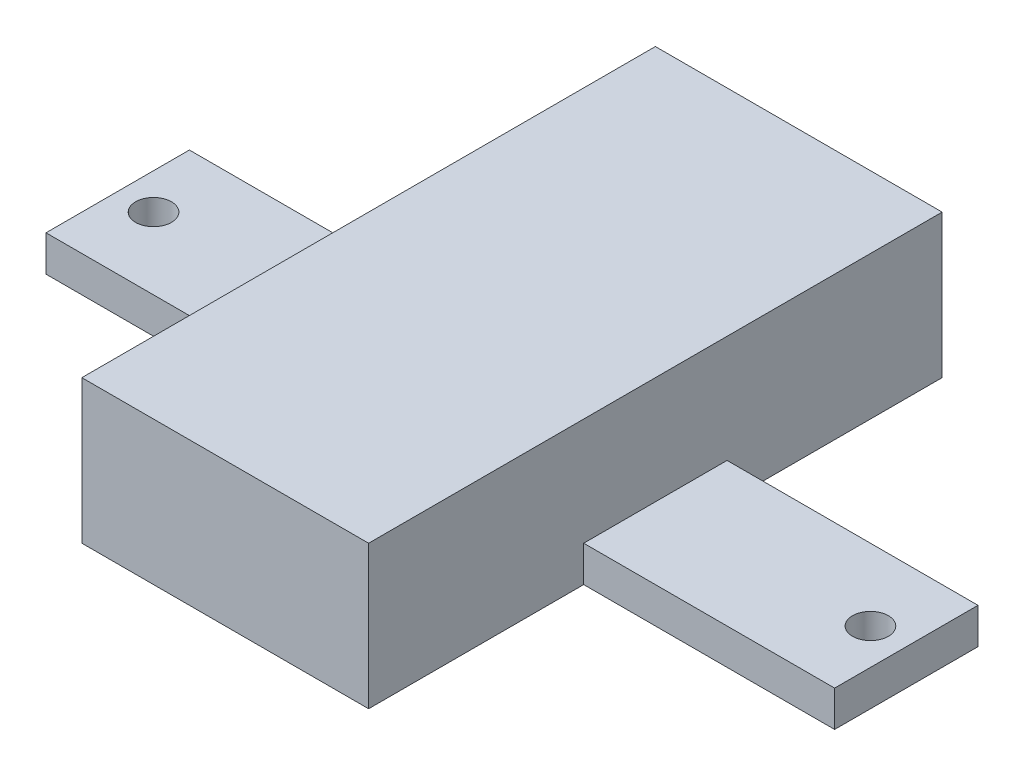
ISO-10303-21;
HEADER;
FILE_DESCRIPTION(('STEP AP214'),'2;1');
FILE_NAME('part.step','',(''),(''),'','','');
FILE_SCHEMA(('AUTOMOTIVE_DESIGN { 1 0 10303 214 1 1 1 1 }'));
ENDSEC;
DATA;
#1=APPLICATION_CONTEXT('core data for automotive mechanical design processes');
#2=APPLICATION_PROTOCOL_DEFINITION('international standard','automotive_design',2000,#1);
#3=PRODUCT_CONTEXT('',#1,'mechanical');
#4=PRODUCT('Part','Part','',(#3));
#5=PRODUCT_RELATED_PRODUCT_CATEGORY('part','',(#4));
#6=PRODUCT_DEFINITION_FORMATION('','',#4);
#7=PRODUCT_DEFINITION_CONTEXT('part definition',#1,'design');
#8=PRODUCT_DEFINITION('design','',#6,#7);
#9=PRODUCT_DEFINITION_SHAPE('','',#8);
#10=(LENGTH_UNIT() NAMED_UNIT(*) SI_UNIT(.MILLI.,.METRE.));
#11=(NAMED_UNIT(*) PLANE_ANGLE_UNIT() SI_UNIT($,.RADIAN.));
#12=(NAMED_UNIT(*) SI_UNIT($,.STERADIAN.) SOLID_ANGLE_UNIT());
#13=UNCERTAINTY_MEASURE_WITH_UNIT(LENGTH_MEASURE(1.E-05),#10,'distance_accuracy_value','');
#14=(GEOMETRIC_REPRESENTATION_CONTEXT(3) GLOBAL_UNCERTAINTY_ASSIGNED_CONTEXT((#13)) GLOBAL_UNIT_ASSIGNED_CONTEXT((#10,
#11,#12)) REPRESENTATION_CONTEXT('',''));
#15=CARTESIAN_POINT('',(0.,0.,0.));
#16=DIRECTION('',(0.,0.,1.));
#17=DIRECTION('',(1.,0.,0.));
#18=AXIS2_PLACEMENT_3D('',#15,#16,#17);
#19=CARTESIAN_POINT('',(-34.925,1.5875,-6.35));
#20=DIRECTION('',(0.,1.,0.));
#21=DIRECTION('',(0.,0.,1.));
#22=AXIS2_PLACEMENT_3D('',#19,#20,#21);
#23=PLANE('',#22);
#24=CARTESIAN_POINT('',(-31.75,1.5875,0.));
#25=DIRECTION('',(0.,1.,0.));
#26=DIRECTION('',(0.,0.,1.));
#27=AXIS2_PLACEMENT_3D('',#24,#25,#26);
#28=CIRCLE('',#27,1.5875);
#29=CARTESIAN_POINT('',(-31.75,1.5875,1.5875));
#30=VERTEX_POINT('',#29);
#31=EDGE_CURVE('E246',#30,#30,#28,.T.);
#32=ORIENTED_EDGE('',*,*,#31,.F.);
#33=EDGE_LOOP('',(#32));
#34=FACE_BOUND('',#33,.T.);
#35=DIRECTION('',(-1.,0.,0.));
#36=VECTOR('',#35,1.);
#37=CARTESIAN_POINT('',(-34.925,1.5875,6.35));
#38=LINE('',#37,#36);
#39=CARTESIAN_POINT('',(-12.7,1.5875,6.35));
#40=VERTEX_POINT('',#39);
#41=CARTESIAN_POINT('',(-34.925,1.5875,6.35));
#42=VERTEX_POINT('',#41);
#43=EDGE_CURVE('E183',#40,#42,#38,.T.);
#44=ORIENTED_EDGE('',*,*,#43,.F.);
#45=DIRECTION('',(0.,0.,-1.));
#46=VECTOR('',#45,1.);
#47=CARTESIAN_POINT('',(-12.7,1.5875,-6.35));
#48=LINE('',#47,#46);
#49=CARTESIAN_POINT('',(-12.7,1.5875,-6.35));
#50=VERTEX_POINT('',#49);
#51=EDGE_CURVE('E163',#40,#50,#48,.T.);
#52=ORIENTED_EDGE('',*,*,#51,.T.);
#53=DIRECTION('',(-1.,0.,0.));
#54=VECTOR('',#53,1.);
#55=CARTESIAN_POINT('',(-34.925,1.5875,-6.35));
#56=LINE('',#55,#54);
#57=CARTESIAN_POINT('',(-34.925,1.5875,-6.35));
#58=VERTEX_POINT('',#57);
#59=EDGE_CURVE('E172',#50,#58,#56,.T.);
#60=ORIENTED_EDGE('',*,*,#59,.T.);
#61=DIRECTION('',(0.,0.,1.));
#62=VECTOR('',#61,1.);
#63=CARTESIAN_POINT('',(-34.925,1.5875,-6.35));
#64=LINE('',#63,#62);
#65=EDGE_CURVE('E195',#58,#42,#64,.T.);
#66=ORIENTED_EDGE('',*,*,#65,.T.);
#67=EDGE_LOOP('',(#44,#52,#60,#66));
#68=FACE_BOUND('',#67,.T.);
#69=ADVANCED_FACE('F33',(#34,#68),#23,.T.);
#70=CARTESIAN_POINT('',(31.75,1.5875,0.));
#71=DIRECTION('',(0.,1.,0.));
#72=DIRECTION('',(0.,0.,-1.));
#73=AXIS2_PLACEMENT_3D('',#70,#71,#72);
#74=CIRCLE('',#73,1.5875);
#75=CARTESIAN_POINT('',(31.75,1.5875,1.5875));
#76=VERTEX_POINT('',#75);
#77=EDGE_CURVE('E254',#76,#76,#74,.T.);
#78=ORIENTED_EDGE('',*,*,#77,.F.);
#79=EDGE_LOOP('',(#78));
#80=FACE_BOUND('',#79,.T.);
#81=CARTESIAN_POINT('',(34.925,1.5875,-6.35));
#82=VERTEX_POINT('',#81);
#83=CARTESIAN_POINT('',(12.7,1.5875,-6.35));
#84=VERTEX_POINT('',#83);
#85=EDGE_CURVE('E174',#82,#84,#56,.T.);
#86=ORIENTED_EDGE('',*,*,#85,.T.);
#87=DIRECTION('',(0.,0.,1.));
#88=VECTOR('',#87,1.);
#89=CARTESIAN_POINT('',(12.7,1.5875,-6.35));
#90=LINE('',#89,#88);
#91=CARTESIAN_POINT('',(12.7,1.5875,6.35));
#92=VERTEX_POINT('',#91);
#93=EDGE_CURVE('E153',#84,#92,#90,.T.);
#94=ORIENTED_EDGE('',*,*,#93,.T.);
#95=CARTESIAN_POINT('',(34.925,1.5875,6.35));
#96=VERTEX_POINT('',#95);
#97=EDGE_CURVE('E184',#96,#92,#38,.T.);
#98=ORIENTED_EDGE('',*,*,#97,.F.);
#99=DIRECTION('',(0.,0.,1.));
#100=VECTOR('',#99,1.);
#101=CARTESIAN_POINT('',(34.925,1.5875,-6.35));
#102=LINE('',#101,#100);
#103=EDGE_CURVE('E85',#82,#96,#102,.T.);
#104=ORIENTED_EDGE('',*,*,#103,.F.);
#105=EDGE_LOOP('',(#86,#94,#98,#104));
#106=FACE_BOUND('',#105,.T.);
#107=ADVANCED_FACE('F202',(#80,#106),#23,.T.);
#108=CARTESIAN_POINT('',(0.,0.,-6.35));
#109=DIRECTION('',(0.,0.,1.));
#110=DIRECTION('',(1.,0.,0.));
#111=AXIS2_PLACEMENT_3D('',#108,#109,#110);
#112=PLANE('',#111);
#113=DIRECTION('',(0.,1.,0.));
#114=VECTOR('',#113,1.);
#115=CARTESIAN_POINT('',(-12.7,0.,-6.35));
#116=LINE('',#115,#114);
#117=CARTESIAN_POINT('',(-12.7,-1.5875,-6.35));
#118=VERTEX_POINT('',#117);
#119=EDGE_CURVE('E166',#118,#50,#116,.T.);
#120=ORIENTED_EDGE('',*,*,#119,.F.);
#121=DIRECTION('',(1.,0.,0.));
#122=VECTOR('',#121,1.);
#123=CARTESIAN_POINT('',(-34.925,-1.5875,-6.35));
#124=LINE('',#123,#122);
#125=CARTESIAN_POINT('',(-34.925,-1.5875,-6.35));
#126=VERTEX_POINT('',#125);
#127=EDGE_CURVE('E179',#126,#118,#124,.T.);
#128=ORIENTED_EDGE('',*,*,#127,.F.);
#129=DIRECTION('',(0.,-1.,0.));
#130=VECTOR('',#129,1.);
#131=CARTESIAN_POINT('',(-34.925,1.5875,-6.35));
#132=LINE('',#131,#130);
#133=EDGE_CURVE('E176',#58,#126,#132,.T.);
#134=ORIENTED_EDGE('',*,*,#133,.F.);
#135=ORIENTED_EDGE('',*,*,#59,.F.);
#136=EDGE_LOOP('',(#120,#128,#134,#135));
#137=FACE_BOUND('',#136,.T.);
#138=ADVANCED_FACE('F209',(#137),#112,.F.);
#139=DIRECTION('',(0.,-1.,0.));
#140=VECTOR('',#139,1.);
#141=CARTESIAN_POINT('',(12.7,0.,-6.35));
#142=LINE('',#141,#140);
#143=CARTESIAN_POINT('',(12.7,-1.5875,-6.35));
#144=VERTEX_POINT('',#143);
#145=EDGE_CURVE('E157',#84,#144,#142,.T.);
#146=ORIENTED_EDGE('',*,*,#145,.F.);
#147=ORIENTED_EDGE('',*,*,#85,.F.);
#148=DIRECTION('',(0.,1.,0.));
#149=VECTOR('',#148,1.);
#150=CARTESIAN_POINT('',(34.925,1.5875,-6.35));
#151=LINE('',#150,#149);
#152=CARTESIAN_POINT('',(34.925,-1.5875,-6.35));
#153=VERTEX_POINT('',#152);
#154=EDGE_CURVE('E169',#153,#82,#151,.T.);
#155=ORIENTED_EDGE('',*,*,#154,.F.);
#156=EDGE_CURVE('E57',#144,#153,#124,.T.);
#157=ORIENTED_EDGE('',*,*,#156,.F.);
#158=EDGE_LOOP('',(#146,#147,#155,#157));
#159=FACE_BOUND('',#158,.T.);
#160=ADVANCED_FACE('F206',(#159),#112,.F.);
#161=CARTESIAN_POINT('',(0.,0.,6.35));
#162=DIRECTION('',(0.,0.,1.));
#163=DIRECTION('',(1.,0.,0.));
#164=AXIS2_PLACEMENT_3D('',#161,#162,#163);
#165=PLANE('',#164);
#166=DIRECTION('',(1.,0.,0.));
#167=VECTOR('',#166,1.);
#168=CARTESIAN_POINT('',(-34.925,-1.5875,6.35));
#169=LINE('',#168,#167);
#170=CARTESIAN_POINT('',(-34.925,-1.5875,6.35));
#171=VERTEX_POINT('',#170);
#172=CARTESIAN_POINT('',(-12.7,-1.5875,6.35));
#173=VERTEX_POINT('',#172);
#174=EDGE_CURVE('E173',#171,#173,#169,.T.);
#175=ORIENTED_EDGE('',*,*,#174,.T.);
#176=DIRECTION('',(0.,1.,0.));
#177=VECTOR('',#176,1.);
#178=CARTESIAN_POINT('',(-12.7,0.,6.35));
#179=LINE('',#178,#177);
#180=EDGE_CURVE('E11',#173,#40,#179,.T.);
#181=ORIENTED_EDGE('',*,*,#180,.T.);
#182=ORIENTED_EDGE('',*,*,#43,.T.);
#183=DIRECTION('',(0.,-1.,0.));
#184=VECTOR('',#183,1.);
#185=CARTESIAN_POINT('',(-34.925,1.5875,6.35));
#186=LINE('',#185,#184);
#187=EDGE_CURVE('E187',#42,#171,#186,.T.);
#188=ORIENTED_EDGE('',*,*,#187,.T.);
#189=EDGE_LOOP('',(#175,#181,#182,#188));
#190=FACE_BOUND('',#189,.T.);
#191=ADVANCED_FACE('F208',(#190),#165,.T.);
#192=ORIENTED_EDGE('',*,*,#97,.T.);
#193=DIRECTION('',(0.,-1.,0.));
#194=VECTOR('',#193,1.);
#195=CARTESIAN_POINT('',(12.7,0.,6.35));
#196=LINE('',#195,#194);
#197=CARTESIAN_POINT('',(12.7,-1.5875,6.35));
#198=VERTEX_POINT('',#197);
#199=EDGE_CURVE('E41',#92,#198,#196,.T.);
#200=ORIENTED_EDGE('',*,*,#199,.T.);
#201=CARTESIAN_POINT('',(34.925,-1.5875,6.35));
#202=VERTEX_POINT('',#201);
#203=EDGE_CURVE('E79',#198,#202,#169,.T.);
#204=ORIENTED_EDGE('',*,*,#203,.T.);
#205=DIRECTION('',(0.,1.,0.));
#206=VECTOR('',#205,1.);
#207=CARTESIAN_POINT('',(34.925,1.5875,6.35));
#208=LINE('',#207,#206);
#209=EDGE_CURVE('E168',#202,#96,#208,.T.);
#210=ORIENTED_EDGE('',*,*,#209,.T.);
#211=EDGE_LOOP('',(#192,#200,#204,#210));
#212=FACE_BOUND('',#211,.T.);
#213=ADVANCED_FACE('F198',(#212),#165,.T.);
#214=CARTESIAN_POINT('',(34.925,1.5875,-6.35));
#215=DIRECTION('',(1.,0.,0.));
#216=DIRECTION('',(0.,0.,-1.));
#217=AXIS2_PLACEMENT_3D('',#214,#215,#216);
#218=PLANE('',#217);
#219=ORIENTED_EDGE('',*,*,#209,.F.);
#220=DIRECTION('',(0.,0.,1.));
#221=VECTOR('',#220,1.);
#222=CARTESIAN_POINT('',(34.925,-1.5875,-6.35));
#223=LINE('',#222,#221);
#224=EDGE_CURVE('E191',#153,#202,#223,.T.);
#225=ORIENTED_EDGE('',*,*,#224,.F.);
#226=ORIENTED_EDGE('',*,*,#154,.T.);
#227=ORIENTED_EDGE('',*,*,#103,.T.);
#228=EDGE_LOOP('',(#219,#225,#226,#227));
#229=FACE_BOUND('',#228,.T.);
#230=ADVANCED_FACE('F35',(#229),#218,.T.);
#231=CARTESIAN_POINT('',(-34.925,-1.5875,-6.35));
#232=DIRECTION('',(0.,-1.,0.));
#233=DIRECTION('',(0.,0.,-1.));
#234=AXIS2_PLACEMENT_3D('',#231,#232,#233);
#235=PLANE('',#234);
#236=CARTESIAN_POINT('',(31.75,-1.5875,0.));
#237=DIRECTION('',(0.,1.,0.));
#238=DIRECTION('',(0.,0.,-1.));
#239=AXIS2_PLACEMENT_3D('',#236,#237,#238);
#240=CIRCLE('',#239,1.5875);
#241=CARTESIAN_POINT('',(31.75,-1.5875,1.5875));
#242=VERTEX_POINT('',#241);
#243=EDGE_CURVE('E240',#242,#242,#240,.T.);
#244=ORIENTED_EDGE('',*,*,#243,.T.);
#245=EDGE_LOOP('',(#244));
#246=FACE_BOUND('',#245,.T.);
#247=CARTESIAN_POINT('',(-31.75,-1.5875,0.));
#248=DIRECTION('',(0.,1.,0.));
#249=DIRECTION('',(0.,0.,1.));
#250=AXIS2_PLACEMENT_3D('',#247,#248,#249);
#251=CIRCLE('',#250,1.5875);
#252=CARTESIAN_POINT('',(-31.75,-1.5875,1.5875));
#253=VERTEX_POINT('',#252);
#254=EDGE_CURVE('E243',#253,#253,#251,.T.);
#255=ORIENTED_EDGE('',*,*,#254,.T.);
#256=EDGE_LOOP('',(#255));
#257=FACE_BOUND('',#256,.T.);
#258=DIRECTION('',(0.,0.,-1.));
#259=VECTOR('',#258,1.);
#260=CARTESIAN_POINT('',(-12.7,-1.5875,25.4));
#261=LINE('',#260,#259);
#262=CARTESIAN_POINT('',(-12.7,-1.5875,25.4));
#263=VERTEX_POINT('',#262);
#264=EDGE_CURVE('E137',#263,#173,#261,.T.);
#265=ORIENTED_EDGE('',*,*,#264,.T.);
#266=ORIENTED_EDGE('',*,*,#174,.F.);
#267=DIRECTION('',(0.,0.,1.));
#268=VECTOR('',#267,1.);
#269=CARTESIAN_POINT('',(-34.925,-1.5875,-6.35));
#270=LINE('',#269,#268);
#271=EDGE_CURVE('E193',#126,#171,#270,.T.);
#272=ORIENTED_EDGE('',*,*,#271,.F.);
#273=ORIENTED_EDGE('',*,*,#127,.T.);
#274=CARTESIAN_POINT('',(-12.7,-1.5875,-25.4));
#275=VERTEX_POINT('',#274);
#276=EDGE_CURVE('E154',#118,#275,#261,.T.);
#277=ORIENTED_EDGE('',*,*,#276,.T.);
#278=DIRECTION('',(1.,0.,0.));
#279=VECTOR('',#278,1.);
#280=CARTESIAN_POINT('',(-12.7,-1.5875,-25.4));
#281=LINE('',#280,#279);
#282=CARTESIAN_POINT('',(12.7,-1.5875,-25.4));
#283=VERTEX_POINT('',#282);
#284=EDGE_CURVE('E249',#275,#283,#281,.T.);
#285=ORIENTED_EDGE('',*,*,#284,.T.);
#286=DIRECTION('',(0.,0.,-1.));
#287=VECTOR('',#286,1.);
#288=CARTESIAN_POINT('',(12.7,-1.5875,25.4));
#289=LINE('',#288,#287);
#290=EDGE_CURVE('E267',#144,#283,#289,.T.);
#291=ORIENTED_EDGE('',*,*,#290,.F.);
#292=ORIENTED_EDGE('',*,*,#156,.T.);
#293=ORIENTED_EDGE('',*,*,#224,.T.);
#294=ORIENTED_EDGE('',*,*,#203,.F.);
#295=CARTESIAN_POINT('',(12.7,-1.5875,25.4));
#296=VERTEX_POINT('',#295);
#297=EDGE_CURVE('E48',#296,#198,#289,.T.);
#298=ORIENTED_EDGE('',*,*,#297,.F.);
#299=DIRECTION('',(1.,0.,0.));
#300=VECTOR('',#299,1.);
#301=CARTESIAN_POINT('',(-12.7,-1.5875,25.4));
#302=LINE('',#301,#300);
#303=EDGE_CURVE('E132',#263,#296,#302,.T.);
#304=ORIENTED_EDGE('',*,*,#303,.F.);
#305=EDGE_LOOP('',(#265,#266,#272,#273,#277,#285,#291,#292,#293,#294,#298,#304));
#306=FACE_BOUND('',#305,.T.);
#307=ADVANCED_FACE('F134',(#246,#257,#306),#235,.T.);
#308=CARTESIAN_POINT('',(-34.925,1.5875,-6.35));
#309=DIRECTION('',(-1.,0.,0.));
#310=DIRECTION('',(0.,0.,1.));
#311=AXIS2_PLACEMENT_3D('',#308,#309,#310);
#312=PLANE('',#311);
#313=ORIENTED_EDGE('',*,*,#187,.F.);
#314=ORIENTED_EDGE('',*,*,#65,.F.);
#315=ORIENTED_EDGE('',*,*,#133,.T.);
#316=ORIENTED_EDGE('',*,*,#271,.T.);
#317=EDGE_LOOP('',(#313,#314,#315,#316));
#318=FACE_BOUND('',#317,.T.);
#319=ADVANCED_FACE('F228',(#318),#312,.T.);
#320=CARTESIAN_POINT('',(-12.7,-1.5875,25.4));
#321=DIRECTION('',(1.,0.,0.));
#322=DIRECTION('',(0.,1.,0.));
#323=AXIS2_PLACEMENT_3D('',#320,#321,#322);
#324=PLANE('',#323);
#325=ORIENTED_EDGE('',*,*,#276,.F.);
#326=ORIENTED_EDGE('',*,*,#119,.T.);
#327=ORIENTED_EDGE('',*,*,#51,.F.);
#328=ORIENTED_EDGE('',*,*,#180,.F.);
#329=ORIENTED_EDGE('',*,*,#264,.F.);
#330=DIRECTION('',(0.,-1.,0.));
#331=VECTOR('',#330,1.);
#332=CARTESIAN_POINT('',(-12.7,-1.5875,25.4));
#333=LINE('',#332,#331);
#334=CARTESIAN_POINT('',(-12.7,11.1125,25.4));
#335=VERTEX_POINT('',#334);
#336=EDGE_CURVE('E141',#335,#263,#333,.T.);
#337=ORIENTED_EDGE('',*,*,#336,.F.);
#338=DIRECTION('',(0.,0.,-1.));
#339=VECTOR('',#338,1.);
#340=CARTESIAN_POINT('',(-12.7,11.1125,25.4));
#341=LINE('',#340,#339);
#342=CARTESIAN_POINT('',(-12.7,11.1125,-25.4));
#343=VERTEX_POINT('',#342);
#344=EDGE_CURVE('E258',#335,#343,#341,.T.);
#345=ORIENTED_EDGE('',*,*,#344,.T.);
#346=DIRECTION('',(0.,-1.,0.));
#347=VECTOR('',#346,1.);
#348=CARTESIAN_POINT('',(-12.7,-1.5875,-25.4));
#349=LINE('',#348,#347);
#350=EDGE_CURVE('E245',#343,#275,#349,.T.);
#351=ORIENTED_EDGE('',*,*,#350,.T.);
#352=EDGE_LOOP('',(#325,#326,#327,#328,#329,#337,#345,#351));
#353=FACE_BOUND('',#352,.T.);
#354=ADVANCED_FACE('F152',(#353),#324,.F.);
#355=CARTESIAN_POINT('',(12.7,-1.5875,25.4));
#356=DIRECTION('',(-1.,0.,0.));
#357=DIRECTION('',(0.,-1.,0.));
#358=AXIS2_PLACEMENT_3D('',#355,#356,#357);
#359=PLANE('',#358);
#360=ORIENTED_EDGE('',*,*,#93,.F.);
#361=ORIENTED_EDGE('',*,*,#145,.T.);
#362=ORIENTED_EDGE('',*,*,#290,.T.);
#363=DIRECTION('',(0.,1.,0.));
#364=VECTOR('',#363,1.);
#365=CARTESIAN_POINT('',(12.7,-1.5875,-25.4));
#366=LINE('',#365,#364);
#367=CARTESIAN_POINT('',(12.7,11.1125,-25.4));
#368=VERTEX_POINT('',#367);
#369=EDGE_CURVE('E262',#283,#368,#366,.T.);
#370=ORIENTED_EDGE('',*,*,#369,.T.);
#371=DIRECTION('',(0.,0.,-1.));
#372=VECTOR('',#371,1.);
#373=CARTESIAN_POINT('',(12.7,11.1125,25.4));
#374=LINE('',#373,#372);
#375=CARTESIAN_POINT('',(12.7,11.1125,25.4));
#376=VERTEX_POINT('',#375);
#377=EDGE_CURVE('E265',#376,#368,#374,.T.);
#378=ORIENTED_EDGE('',*,*,#377,.F.);
#379=DIRECTION('',(0.,1.,0.));
#380=VECTOR('',#379,1.);
#381=CARTESIAN_POINT('',(12.7,-1.5875,25.4));
#382=LINE('',#381,#380);
#383=EDGE_CURVE('E140',#296,#376,#382,.T.);
#384=ORIENTED_EDGE('',*,*,#383,.F.);
#385=ORIENTED_EDGE('',*,*,#297,.T.);
#386=ORIENTED_EDGE('',*,*,#199,.F.);
#387=EDGE_LOOP('',(#360,#361,#362,#370,#378,#384,#385,#386));
#388=FACE_BOUND('',#387,.T.);
#389=ADVANCED_FACE('F204',(#388),#359,.F.);
#390=CARTESIAN_POINT('',(-12.7,11.1125,25.4));
#391=DIRECTION('',(0.,-1.,0.));
#392=DIRECTION('',(1.,0.,0.));
#393=AXIS2_PLACEMENT_3D('',#390,#391,#392);
#394=PLANE('',#393);
#395=DIRECTION('',(-1.,0.,0.));
#396=VECTOR('',#395,1.);
#397=CARTESIAN_POINT('',(-12.7,11.1125,-25.4));
#398=LINE('',#397,#396);
#399=EDGE_CURVE('E150',#368,#343,#398,.T.);
#400=ORIENTED_EDGE('',*,*,#399,.T.);
#401=ORIENTED_EDGE('',*,*,#344,.F.);
#402=DIRECTION('',(-1.,0.,0.));
#403=VECTOR('',#402,1.);
#404=CARTESIAN_POINT('',(-12.7,11.1125,25.4));
#405=LINE('',#404,#403);
#406=EDGE_CURVE('E146',#376,#335,#405,.T.);
#407=ORIENTED_EDGE('',*,*,#406,.F.);
#408=ORIENTED_EDGE('',*,*,#377,.T.);
#409=EDGE_LOOP('',(#400,#401,#407,#408));
#410=FACE_BOUND('',#409,.T.);
#411=ADVANCED_FACE('F276',(#410),#394,.F.);
#412=CARTESIAN_POINT('',(0.,0.,25.4));
#413=DIRECTION('',(0.,0.,-1.));
#414=DIRECTION('',(-1.,0.,0.));
#415=AXIS2_PLACEMENT_3D('',#412,#413,#414);
#416=PLANE('',#415);
#417=ORIENTED_EDGE('',*,*,#336,.T.);
#418=ORIENTED_EDGE('',*,*,#303,.T.);
#419=ORIENTED_EDGE('',*,*,#383,.T.);
#420=ORIENTED_EDGE('',*,*,#406,.T.);
#421=EDGE_LOOP('',(#417,#418,#419,#420));
#422=FACE_BOUND('',#421,.T.);
#423=ADVANCED_FACE('F144',(#422),#416,.F.);
#424=CARTESIAN_POINT('',(0.,0.,-25.4));
#425=DIRECTION('',(0.,0.,-1.));
#426=DIRECTION('',(-1.,0.,0.));
#427=AXIS2_PLACEMENT_3D('',#424,#425,#426);
#428=PLANE('',#427);
#429=ORIENTED_EDGE('',*,*,#350,.F.);
#430=ORIENTED_EDGE('',*,*,#399,.F.);
#431=ORIENTED_EDGE('',*,*,#369,.F.);
#432=ORIENTED_EDGE('',*,*,#284,.F.);
#433=EDGE_LOOP('',(#429,#430,#431,#432));
#434=FACE_BOUND('',#433,.T.);
#435=ADVANCED_FACE('F275',(#434),#428,.T.);
#436=CARTESIAN_POINT('',(-31.75,-1.5875,0.));
#437=DIRECTION('',(0.,1.,0.));
#438=DIRECTION('',(0.,0.,1.));
#439=AXIS2_PLACEMENT_3D('',#436,#437,#438);
#440=CYLINDRICAL_SURFACE('',#439,1.5875);
#441=CARTESIAN_POINT('',(-31.75,-1.5875,1.5875));
#442=CARTESIAN_POINT('',(-31.75,-1.55442708333333,1.5875));
#443=CARTESIAN_POINT('',(-31.75,-1.52135416666667,1.5875));
#444=CARTESIAN_POINT('',(-31.75,-1.45520833333333,1.5875));
#445=CARTESIAN_POINT('',(-31.75,-1.42213541666667,1.5875));
#446=CARTESIAN_POINT('',(-31.75,-1.35598958333333,1.5875));
#447=CARTESIAN_POINT('',(-31.75,-1.32291666666667,1.5875));
#448=CARTESIAN_POINT('',(-31.75,-1.25677083333333,1.5875));
#449=CARTESIAN_POINT('',(-31.75,-1.22369791666667,1.5875));
#450=CARTESIAN_POINT('',(-31.75,-1.15755208333333,1.5875));
#451=CARTESIAN_POINT('',(-31.75,-1.12447916666667,1.5875));
#452=CARTESIAN_POINT('',(-31.75,-1.05833333333333,1.5875));
#453=CARTESIAN_POINT('',(-31.75,-1.02526041666667,1.5875));
#454=CARTESIAN_POINT('',(-31.75,-0.959114583333334,1.5875));
#455=CARTESIAN_POINT('',(-31.75,-0.926041666666667,1.5875));
#456=CARTESIAN_POINT('',(-31.75,-0.859895833333334,1.5875));
#457=CARTESIAN_POINT('',(-31.75,-0.826822916666667,1.5875));
#458=CARTESIAN_POINT('',(-31.75,-0.760677083333334,1.5875));
#459=CARTESIAN_POINT('',(-31.75,-0.727604166666667,1.5875));
#460=CARTESIAN_POINT('',(-31.75,-0.661458333333333,1.5875));
#461=CARTESIAN_POINT('',(-31.75,-0.628385416666667,1.5875));
#462=CARTESIAN_POINT('',(-31.75,-0.562239583333333,1.5875));
#463=CARTESIAN_POINT('',(-31.75,-0.529166666666667,1.5875));
#464=CARTESIAN_POINT('',(-31.75,-0.463020833333333,1.5875));
#465=CARTESIAN_POINT('',(-31.75,-0.429947916666667,1.5875));
#466=CARTESIAN_POINT('',(-31.75,-0.363802083333333,1.5875));
#467=CARTESIAN_POINT('',(-31.75,-0.330729166666667,1.5875));
#468=CARTESIAN_POINT('',(-31.75,-0.264583333333333,1.5875));
#469=CARTESIAN_POINT('',(-31.75,-0.231510416666667,1.5875));
#470=CARTESIAN_POINT('',(-31.75,-0.165364583333333,1.5875));
#471=CARTESIAN_POINT('',(-31.75,-0.132291666666667,1.5875));
#472=CARTESIAN_POINT('',(-31.75,-0.0661458333333333,1.5875));
#473=CARTESIAN_POINT('',(-31.75,-0.0330729166666666,1.5875));
#474=CARTESIAN_POINT('',(-31.75,0.0330729166666666,1.5875));
#475=CARTESIAN_POINT('',(-31.75,0.0661458333333333,1.5875));
#476=CARTESIAN_POINT('',(-31.75,0.132291666666667,1.5875));
#477=CARTESIAN_POINT('',(-31.75,0.165364583333333,1.5875));
#478=CARTESIAN_POINT('',(-31.75,0.231510416666667,1.5875));
#479=CARTESIAN_POINT('',(-31.75,0.264583333333333,1.5875));
#480=CARTESIAN_POINT('',(-31.75,0.330729166666667,1.5875));
#481=CARTESIAN_POINT('',(-31.75,0.363802083333333,1.5875));
#482=CARTESIAN_POINT('',(-31.75,0.429947916666666,1.5875));
#483=CARTESIAN_POINT('',(-31.75,0.463020833333333,1.5875));
#484=CARTESIAN_POINT('',(-31.75,0.529166666666667,1.5875));
#485=CARTESIAN_POINT('',(-31.75,0.562239583333333,1.5875));
#486=CARTESIAN_POINT('',(-31.75,0.628385416666667,1.5875));
#487=CARTESIAN_POINT('',(-31.75,0.661458333333333,1.5875));
#488=CARTESIAN_POINT('',(-31.75,0.727604166666667,1.5875));
#489=CARTESIAN_POINT('',(-31.75,0.760677083333333,1.5875));
#490=CARTESIAN_POINT('',(-31.75,0.826822916666667,1.5875));
#491=CARTESIAN_POINT('',(-31.75,0.859895833333333,1.5875));
#492=CARTESIAN_POINT('',(-31.75,0.926041666666666,1.5875));
#493=CARTESIAN_POINT('',(-31.75,0.959114583333333,1.5875));
#494=CARTESIAN_POINT('',(-31.75,1.02526041666667,1.5875));
#495=CARTESIAN_POINT('',(-31.75,1.05833333333333,1.5875));
#496=CARTESIAN_POINT('',(-31.75,1.12447916666667,1.5875));
#497=CARTESIAN_POINT('',(-31.75,1.15755208333333,1.5875));
#498=CARTESIAN_POINT('',(-31.75,1.22369791666667,1.5875));
#499=CARTESIAN_POINT('',(-31.75,1.25677083333333,1.5875));
#500=CARTESIAN_POINT('',(-31.75,1.32291666666667,1.5875));
#501=CARTESIAN_POINT('',(-31.75,1.35598958333333,1.5875));
#502=CARTESIAN_POINT('',(-31.75,1.42213541666667,1.5875));
#503=CARTESIAN_POINT('',(-31.75,1.45520833333333,1.5875));
#504=CARTESIAN_POINT('',(-31.75,1.52135416666667,1.5875));
#505=CARTESIAN_POINT('',(-31.75,1.55442708333333,1.5875));
#506=CARTESIAN_POINT('',(-31.75,1.5875,1.5875));
#507=B_SPLINE_CURVE_WITH_KNOTS('',3,(#441,#442,#443,#444,#445,#446,#447,#448,#449,#450,#451,
#452,#453,#454,#455,#456,#457,#458,#459,#460,#461,#462,#463,#464,#465,#466,#467,#468,#469,#470,
#471,#472,#473,#474,#475,#476,#477,#478,#479,#480,#481,#482,#483,#484,#485,#486,#487,#488,#489,
#490,#491,#492,#493,#494,#495,#496,#497,#498,#499,#500,#501,#502,#503,#504,#505,#506),
.UNSPECIFIED.,.F.,.F.,(4,2,2,2,2,2,2,2,2,2,2,2,2,2,2,2,2,2,2,2,2,2,2,2,2,2,2,2,2,2,2,2,4),(0.,
0.0992187499999999,0.1984375,0.29765625,0.396875,0.49609375,0.5953125,0.69453125,0.79375,
0.89296875,0.9921875,1.09140625,1.190625,1.28984375,1.3890625,1.48828125,1.5875,1.68671875,
1.7859375,1.88515625,1.984375,2.08359375,2.1828125,2.28203125,2.38125,2.48046875,2.5796875,
2.67890625,2.778125,2.87734375,2.9765625,3.07578125,3.175),.UNSPECIFIED.);
#508=EDGE_CURVE('BSEAM321',#253,#30,#507,.T.);
#509=ORIENTED_EDGE('',*,*,#254,.F.);
#510=ORIENTED_EDGE('',*,*,#31,.T.);
#511=ORIENTED_EDGE('',*,*,#508,.T.);
#512=ORIENTED_EDGE('',*,*,#508,.F.);
#513=EDGE_LOOP('',(#509,#511,#510,#512));
#514=FACE_BOUND('',#513,.T.);
#515=ADVANCED_FACE('F321',(#514),#440,.F.);
#516=CARTESIAN_POINT('',(31.75,-1.5875,0.));
#517=DIRECTION('',(0.,1.,0.));
#518=DIRECTION('',(0.,0.,1.));
#519=AXIS2_PLACEMENT_3D('',#516,#517,#518);
#520=CYLINDRICAL_SURFACE('',#519,1.5875);
#521=CARTESIAN_POINT('',(31.75,-1.5875,1.5875));
#522=CARTESIAN_POINT('',(31.75,-1.55442708333333,1.5875));
#523=CARTESIAN_POINT('',(31.75,-1.52135416666667,1.5875));
#524=CARTESIAN_POINT('',(31.75,-1.45520833333333,1.5875));
#525=CARTESIAN_POINT('',(31.75,-1.42213541666667,1.5875));
#526=CARTESIAN_POINT('',(31.75,-1.35598958333333,1.5875));
#527=CARTESIAN_POINT('',(31.75,-1.32291666666667,1.5875));
#528=CARTESIAN_POINT('',(31.75,-1.25677083333333,1.5875));
#529=CARTESIAN_POINT('',(31.75,-1.22369791666667,1.5875));
#530=CARTESIAN_POINT('',(31.75,-1.15755208333333,1.5875));
#531=CARTESIAN_POINT('',(31.75,-1.12447916666667,1.5875));
#532=CARTESIAN_POINT('',(31.75,-1.05833333333333,1.5875));
#533=CARTESIAN_POINT('',(31.75,-1.02526041666667,1.5875));
#534=CARTESIAN_POINT('',(31.75,-0.959114583333334,1.5875));
#535=CARTESIAN_POINT('',(31.75,-0.926041666666667,1.5875));
#536=CARTESIAN_POINT('',(31.75,-0.859895833333334,1.5875));
#537=CARTESIAN_POINT('',(31.75,-0.826822916666667,1.5875));
#538=CARTESIAN_POINT('',(31.75,-0.760677083333334,1.5875));
#539=CARTESIAN_POINT('',(31.75,-0.727604166666667,1.5875));
#540=CARTESIAN_POINT('',(31.75,-0.661458333333333,1.5875));
#541=CARTESIAN_POINT('',(31.75,-0.628385416666667,1.5875));
#542=CARTESIAN_POINT('',(31.75,-0.562239583333333,1.5875));
#543=CARTESIAN_POINT('',(31.75,-0.529166666666667,1.5875));
#544=CARTESIAN_POINT('',(31.75,-0.463020833333333,1.5875));
#545=CARTESIAN_POINT('',(31.75,-0.429947916666667,1.5875));
#546=CARTESIAN_POINT('',(31.75,-0.363802083333333,1.5875));
#547=CARTESIAN_POINT('',(31.75,-0.330729166666667,1.5875));
#548=CARTESIAN_POINT('',(31.75,-0.264583333333333,1.5875));
#549=CARTESIAN_POINT('',(31.75,-0.231510416666667,1.5875));
#550=CARTESIAN_POINT('',(31.75,-0.165364583333333,1.5875));
#551=CARTESIAN_POINT('',(31.75,-0.132291666666667,1.5875));
#552=CARTESIAN_POINT('',(31.75,-0.0661458333333333,1.5875));
#553=CARTESIAN_POINT('',(31.75,-0.0330729166666666,1.5875));
#554=CARTESIAN_POINT('',(31.75,0.0330729166666666,1.5875));
#555=CARTESIAN_POINT('',(31.75,0.0661458333333333,1.5875));
#556=CARTESIAN_POINT('',(31.75,0.132291666666667,1.5875));
#557=CARTESIAN_POINT('',(31.75,0.165364583333333,1.5875));
#558=CARTESIAN_POINT('',(31.75,0.231510416666667,1.5875));
#559=CARTESIAN_POINT('',(31.75,0.264583333333333,1.5875));
#560=CARTESIAN_POINT('',(31.75,0.330729166666667,1.5875));
#561=CARTESIAN_POINT('',(31.75,0.363802083333333,1.5875));
#562=CARTESIAN_POINT('',(31.75,0.429947916666666,1.5875));
#563=CARTESIAN_POINT('',(31.75,0.463020833333333,1.5875));
#564=CARTESIAN_POINT('',(31.75,0.529166666666667,1.5875));
#565=CARTESIAN_POINT('',(31.75,0.562239583333333,1.5875));
#566=CARTESIAN_POINT('',(31.75,0.628385416666667,1.5875));
#567=CARTESIAN_POINT('',(31.75,0.661458333333333,1.5875));
#568=CARTESIAN_POINT('',(31.75,0.727604166666667,1.5875));
#569=CARTESIAN_POINT('',(31.75,0.760677083333333,1.5875));
#570=CARTESIAN_POINT('',(31.75,0.826822916666667,1.5875));
#571=CARTESIAN_POINT('',(31.75,0.859895833333333,1.5875));
#572=CARTESIAN_POINT('',(31.75,0.926041666666666,1.5875));
#573=CARTESIAN_POINT('',(31.75,0.959114583333333,1.5875));
#574=CARTESIAN_POINT('',(31.75,1.02526041666667,1.5875));
#575=CARTESIAN_POINT('',(31.75,1.05833333333333,1.5875));
#576=CARTESIAN_POINT('',(31.75,1.12447916666667,1.5875));
#577=CARTESIAN_POINT('',(31.75,1.15755208333333,1.5875));
#578=CARTESIAN_POINT('',(31.75,1.22369791666667,1.5875));
#579=CARTESIAN_POINT('',(31.75,1.25677083333333,1.5875));
#580=CARTESIAN_POINT('',(31.75,1.32291666666667,1.5875));
#581=CARTESIAN_POINT('',(31.75,1.35598958333333,1.5875));
#582=CARTESIAN_POINT('',(31.75,1.42213541666667,1.5875));
#583=CARTESIAN_POINT('',(31.75,1.45520833333333,1.5875));
#584=CARTESIAN_POINT('',(31.75,1.52135416666667,1.5875));
#585=CARTESIAN_POINT('',(31.75,1.55442708333333,1.5875));
#586=CARTESIAN_POINT('',(31.75,1.5875,1.5875));
#587=B_SPLINE_CURVE_WITH_KNOTS('',3,(#521,#522,#523,#524,#525,#526,#527,#528,#529,#530,#531,
#532,#533,#534,#535,#536,#537,#538,#539,#540,#541,#542,#543,#544,#545,#546,#547,#548,#549,#550,
#551,#552,#553,#554,#555,#556,#557,#558,#559,#560,#561,#562,#563,#564,#565,#566,#567,#568,#569,
#570,#571,#572,#573,#574,#575,#576,#577,#578,#579,#580,#581,#582,#583,#584,#585,#586),
.UNSPECIFIED.,.F.,.F.,(4,2,2,2,2,2,2,2,2,2,2,2,2,2,2,2,2,2,2,2,2,2,2,2,2,2,2,2,2,2,2,2,4),(0.,
0.0992187499999999,0.1984375,0.29765625,0.396875,0.49609375,0.5953125,0.69453125,0.79375,
0.89296875,0.9921875,1.09140625,1.190625,1.28984375,1.3890625,1.48828125,1.5875,1.68671875,
1.7859375,1.88515625,1.984375,2.08359375,2.1828125,2.28203125,2.38125,2.48046875,2.5796875,
2.67890625,2.778125,2.87734375,2.9765625,3.07578125,3.175),.UNSPECIFIED.);
#588=EDGE_CURVE('BSEAM346',#242,#76,#587,.T.);
#589=ORIENTED_EDGE('',*,*,#243,.F.);
#590=ORIENTED_EDGE('',*,*,#77,.T.);
#591=ORIENTED_EDGE('',*,*,#588,.T.);
#592=ORIENTED_EDGE('',*,*,#588,.F.);
#593=EDGE_LOOP('',(#589,#591,#590,#592));
#594=FACE_BOUND('',#593,.T.);
#595=ADVANCED_FACE('F346',(#594),#520,.F.);
#596=CLOSED_SHELL('',(#69,#107,#138,#160,#191,#213,#230,#307,#319,#354,#389,#411,#423,#435,#515,#595));
#597=MANIFOLD_SOLID_BREP('B2',#596);
#598=ADVANCED_BREP_SHAPE_REPRESENTATION('',(#18,#597),#14);
#599=SHAPE_DEFINITION_REPRESENTATION(#9,#598);
ENDSEC;
END-ISO-10303-21;
